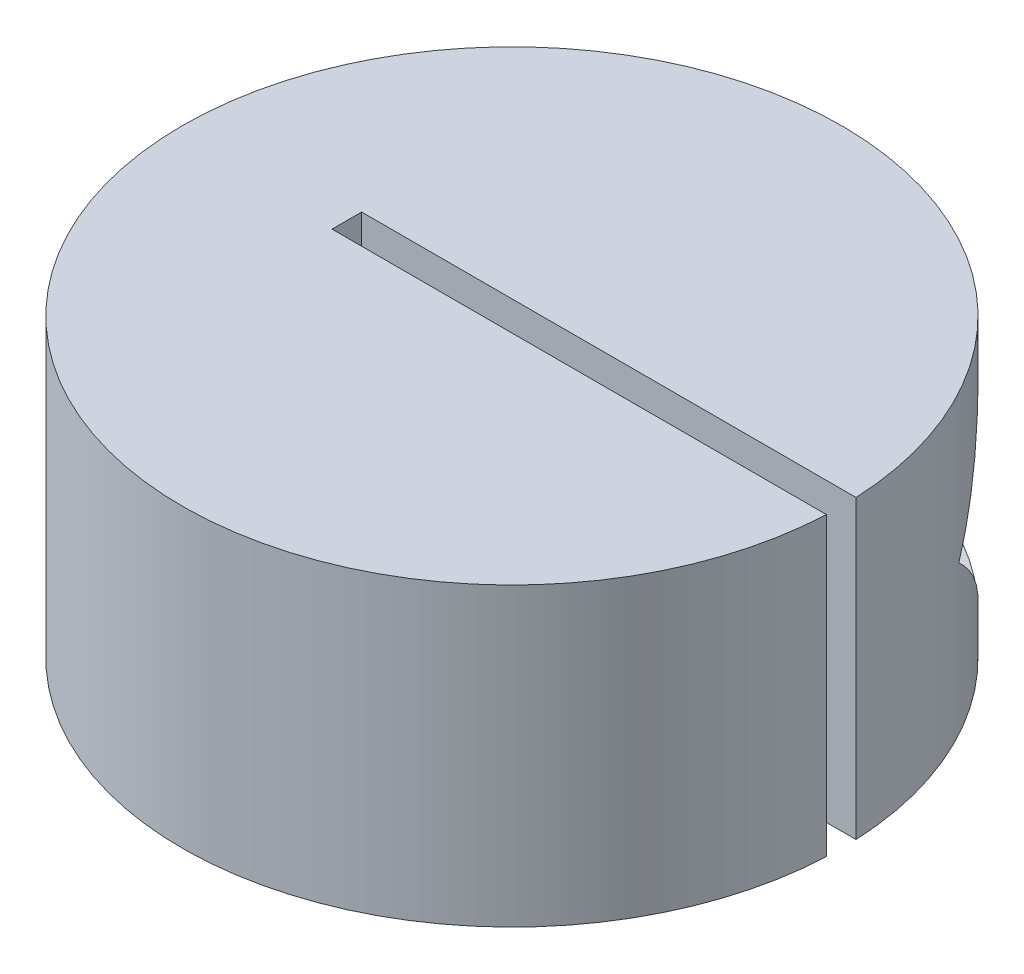
ISO-10303-21;
HEADER;
FILE_DESCRIPTION(('STEP AP214'),'2;1');
FILE_NAME('part.step','',(''),(''),'','','');
FILE_SCHEMA(('AUTOMOTIVE_DESIGN { 1 0 10303 214 1 1 1 1 }'));
ENDSEC;
DATA;
#1=APPLICATION_CONTEXT('core data for automotive mechanical design processes');
#2=APPLICATION_PROTOCOL_DEFINITION('international standard','automotive_design',2000,#1);
#3=PRODUCT_CONTEXT('',#1,'mechanical');
#4=PRODUCT('Part','Part','',(#3));
#5=PRODUCT_RELATED_PRODUCT_CATEGORY('part','',(#4));
#6=PRODUCT_DEFINITION_FORMATION('','',#4);
#7=PRODUCT_DEFINITION_CONTEXT('part definition',#1,'design');
#8=PRODUCT_DEFINITION('design','',#6,#7);
#9=PRODUCT_DEFINITION_SHAPE('','',#8);
#10=(LENGTH_UNIT() NAMED_UNIT(*) SI_UNIT(.MILLI.,.METRE.));
#11=(NAMED_UNIT(*) PLANE_ANGLE_UNIT() SI_UNIT($,.RADIAN.));
#12=(NAMED_UNIT(*) SI_UNIT($,.STERADIAN.) SOLID_ANGLE_UNIT());
#13=UNCERTAINTY_MEASURE_WITH_UNIT(LENGTH_MEASURE(1.E-05),#10,'distance_accuracy_value','');
#14=(GEOMETRIC_REPRESENTATION_CONTEXT(3) GLOBAL_UNCERTAINTY_ASSIGNED_CONTEXT((#13)) GLOBAL_UNIT_ASSIGNED_CONTEXT((#10,
#11,#12)) REPRESENTATION_CONTEXT('',''));
#15=CARTESIAN_POINT('',(0.,0.,0.));
#16=DIRECTION('',(0.,0.,1.));
#17=DIRECTION('',(1.,0.,0.));
#18=AXIS2_PLACEMENT_3D('',#15,#16,#17);
#19=CARTESIAN_POINT('',(0.,10.,0.));
#20=DIRECTION('',(0.,-1.,0.));
#21=DIRECTION('',(0.,0.,-1.));
#22=AXIS2_PLACEMENT_3D('',#19,#20,#21);
#23=CYLINDRICAL_SURFACE('',#22,11.125);
#24=CARTESIAN_POINT('',(0.,2.62851619994366,0.));
#25=DIRECTION('',(-0.867932415787894,0.496682314588098,0.));
#26=DIRECTION('',(-0.496682314588098,-0.867932415787894,0.));
#27=AXIS2_PLACEMENT_3D('',#24,#25,#26);
#28=ELLIPSE('',#27,22.3986231706801,11.125);
#29=CARTESIAN_POINT('',(3.44121947068064,8.64190914895799,-10.5793966536192));
#30=VERTEX_POINT('',#29);
#31=CARTESIAN_POINT('',(1.34787389406774,4.98387174753513,-11.0430458192335));
#32=VERTEX_POINT('',#31);
#33=EDGE_CURVE('E227',#30,#32,#28,.T.);
#34=ORIENTED_EDGE('',*,*,#33,.T.);
#35=CARTESIAN_POINT('',(0.,7.29796184481329,0.));
#36=DIRECTION('',(-0.864105709937694,-0.503310363546265,0.));
#37=DIRECTION('',(0.503310363546265,-0.864105709937694,0.));
#38=AXIS2_PLACEMENT_3D('',#35,#36,#37);
#39=ELLIPSE('',#38,22.1036577145254,11.125);
#40=CARTESIAN_POINT('',(3.4691544233871,1.34196259857714,-10.5702692769245));
#41=VERTEX_POINT('',#40);
#42=EDGE_CURVE('E53',#32,#41,#39,.T.);
#43=ORIENTED_EDGE('',*,*,#42,.T.);
#44=CARTESIAN_POINT('',(0.,1.32868706784826,0.));
#45=DIRECTION('',(0.00382670585019994,-0.999992678134363,0.));
#46=DIRECTION('',(-0.999992678134363,-0.00382670585019994,0.));
#47=AXIS2_PLACEMENT_3D('',#44,#45,#46);
#48=ELLIPSE('',#47,11.1250814563516,11.125);
#49=CARTESIAN_POINT('',(7.68378052931936,1.35809085104201,-8.04519370663334));
#50=VERTEX_POINT('',#49);
#51=EDGE_CURVE('E208',#41,#50,#48,.T.);
#52=ORIENTED_EDGE('',*,*,#51,.T.);
#53=CARTESIAN_POINT('',(0.,-12.0690073187948,0.));
#54=DIRECTION('',(0.867932415787894,-0.496682314588097,0.));
#55=DIRECTION('',(-0.496682314588097,-0.867932415787894,0.));
#56=AXIS2_PLACEMENT_3D('',#53,#54,#55);
#57=ELLIPSE('',#56,22.3986231706801,11.125);
#58=CARTESIAN_POINT('',(9.77712610593226,5.01612825246488,-5.30786492939467));
#59=VERTEX_POINT('',#58);
#60=EDGE_CURVE('E215',#50,#59,#57,.T.);
#61=ORIENTED_EDGE('',*,*,#60,.T.);
#62=CARTESIAN_POINT('',(0.,21.8019349968165,0.));
#63=DIRECTION('',(0.864105709937694,0.503310363546265,0.));
#64=DIRECTION('',(0.503310363546265,-0.864105709937694,0.));
#65=AXIS2_PLACEMENT_3D('',#62,#63,#64);
#66=ELLIPSE('',#65,22.1036577145254,11.125);
#67=CARTESIAN_POINT('',(7.6558455766129,8.65803740142286,-8.07178130941718));
#68=VERTEX_POINT('',#67);
#69=EDGE_CURVE('E219',#59,#68,#66,.T.);
#70=ORIENTED_EDGE('',*,*,#69,.T.);
#71=CARTESIAN_POINT('',(0.,8.62874051785876,0.));
#72=DIRECTION('',(-0.00382670585020004,0.999992678134363,0.));
#73=DIRECTION('',(-0.999992678134363,-0.00382670585020004,0.));
#74=AXIS2_PLACEMENT_3D('',#71,#72,#73);
#75=ELLIPSE('',#74,11.1250814563516,11.125);
#76=EDGE_CURVE('E223',#68,#30,#75,.T.);
#77=ORIENTED_EDGE('',*,*,#76,.T.);
#78=EDGE_LOOP('',(#34,#43,#52,#61,#70,#77));
#79=FACE_BOUND('',#78,.T.);
#80=DIRECTION('',(0.,-1.,0.));
#81=VECTOR('',#80,1.);
#82=CARTESIAN_POINT('',(11.1137583651976,10.,-0.500000000000002));
#83=LINE('',#82,#81);
#84=CARTESIAN_POINT('',(11.1137583651976,0.,-0.500000000000002));
#85=VERTEX_POINT('',#84);
#86=CARTESIAN_POINT('',(11.1137583651976,10.,-0.500000000000002));
#87=VERTEX_POINT('',#86);
#88=EDGE_CURVE('E128',#85,#87,#83,.F.);
#89=ORIENTED_EDGE('',*,*,#88,.F.);
#90=CARTESIAN_POINT('',(0.,0.,0.));
#91=DIRECTION('',(0.,1.,0.));
#92=DIRECTION('',(0.,0.,1.));
#93=AXIS2_PLACEMENT_3D('',#90,#91,#92);
#94=CIRCLE('',#93,11.125);
#95=CARTESIAN_POINT('',(11.1137583651976,0.,0.500000000000002));
#96=VERTEX_POINT('',#95);
#97=EDGE_CURVE('E185',#85,#96,#94,.T.);
#98=ORIENTED_EDGE('',*,*,#97,.T.);
#99=DIRECTION('',(0.,-1.,0.));
#100=VECTOR('',#99,1.);
#101=CARTESIAN_POINT('',(11.1137583651976,10.,0.500000000000002));
#102=LINE('',#101,#100);
#103=CARTESIAN_POINT('',(11.1137583651976,10.,0.500000000000002));
#104=VERTEX_POINT('',#103);
#105=EDGE_CURVE('E60',#104,#96,#102,.T.);
#106=ORIENTED_EDGE('',*,*,#105,.F.);
#107=CARTESIAN_POINT('',(0.,10.,0.));
#108=DIRECTION('',(0.,1.,0.));
#109=DIRECTION('',(0.,0.,1.));
#110=AXIS2_PLACEMENT_3D('',#107,#108,#109);
#111=CIRCLE('',#110,11.125);
#112=EDGE_CURVE('E205',#87,#104,#111,.T.);
#113=ORIENTED_EDGE('',*,*,#112,.F.);
#114=EDGE_LOOP('',(#89,#98,#106,#113));
#115=FACE_BOUND('',#114,.T.);
#116=ADVANCED_FACE('F45',(#79,#115),#23,.T.);
#117=CARTESIAN_POINT('',(0.,10.,0.));
#118=DIRECTION('',(0.,1.,0.));
#119=DIRECTION('',(0.,0.,1.));
#120=AXIS2_PLACEMENT_3D('',#117,#118,#119);
#121=PLANE('',#120);
#122=DIRECTION('',(0.,0.,1.));
#123=VECTOR('',#122,1.);
#124=CARTESIAN_POINT('',(-5.57352546433469,10.,-0.5));
#125=LINE('',#124,#123);
#126=CARTESIAN_POINT('',(-5.57352546433469,10.,-0.5));
#127=VERTEX_POINT('',#126);
#128=CARTESIAN_POINT('',(-5.57352546433469,10.,0.5));
#129=VERTEX_POINT('',#128);
#130=EDGE_CURVE('E134',#127,#129,#125,.T.);
#131=ORIENTED_EDGE('',*,*,#130,.F.);
#132=DIRECTION('',(-1.,0.,0.));
#133=VECTOR('',#132,1.);
#134=CARTESIAN_POINT('',(11.4264745356653,10.,-0.500000000000002));
#135=LINE('',#134,#133);
#136=EDGE_CURVE('E122',#87,#127,#135,.T.);
#137=ORIENTED_EDGE('',*,*,#136,.F.);
#138=ORIENTED_EDGE('',*,*,#112,.T.);
#139=DIRECTION('',(1.,0.,0.));
#140=VECTOR('',#139,1.);
#141=CARTESIAN_POINT('',(-5.57352546433469,10.,0.5));
#142=LINE('',#141,#140);
#143=EDGE_CURVE('E147',#129,#104,#142,.T.);
#144=ORIENTED_EDGE('',*,*,#143,.F.);
#145=EDGE_LOOP('',(#131,#137,#138,#144));
#146=FACE_BOUND('',#145,.T.);
#147=ADVANCED_FACE('F146',(#146),#121,.T.);
#148=CARTESIAN_POINT('',(0.,0.,0.));
#149=DIRECTION('',(0.,1.,0.));
#150=DIRECTION('',(0.,0.,1.));
#151=AXIS2_PLACEMENT_3D('',#148,#149,#150);
#152=PLANE('',#151);
#153=DIRECTION('',(-1.,0.,0.));
#154=VECTOR('',#153,1.);
#155=CARTESIAN_POINT('',(11.4264745356653,0.,-0.500000000000002));
#156=LINE('',#155,#154);
#157=CARTESIAN_POINT('',(-5.57352546433469,0.,-0.5));
#158=VERTEX_POINT('',#157);
#159=EDGE_CURVE('E153',#85,#158,#156,.T.);
#160=ORIENTED_EDGE('',*,*,#159,.T.);
#161=DIRECTION('',(0.,0.,1.));
#162=VECTOR('',#161,1.);
#163=CARTESIAN_POINT('',(-5.57352546433469,0.,-0.5));
#164=LINE('',#163,#162);
#165=CARTESIAN_POINT('',(-5.57352546433469,0.,0.5));
#166=VERTEX_POINT('',#165);
#167=EDGE_CURVE('E141',#158,#166,#164,.T.);
#168=ORIENTED_EDGE('',*,*,#167,.T.);
#169=DIRECTION('',(1.,0.,0.));
#170=VECTOR('',#169,1.);
#171=CARTESIAN_POINT('',(-5.57352546433469,0.,0.5));
#172=LINE('',#171,#170);
#173=EDGE_CURVE('E135',#166,#96,#172,.T.);
#174=ORIENTED_EDGE('',*,*,#173,.T.);
#175=ORIENTED_EDGE('',*,*,#97,.F.);
#176=EDGE_LOOP('',(#160,#168,#174,#175));
#177=FACE_BOUND('',#176,.T.);
#178=ADVANCED_FACE('F270',(#177),#152,.F.);
#179=CARTESIAN_POINT('',(1.34787389406774,4.98387174753513,-11.125));
#180=DIRECTION('',(-0.864105709937694,-0.503310363546265,0.));
#181=DIRECTION('',(0.503310363546265,-0.864105709937694,0.));
#182=AXIS2_PLACEMENT_3D('',#179,#180,#181);
#183=PLANE('',#182);
#184=DIRECTION('',(-0.503310363546265,0.864105709937694,0.));
#185=VECTOR('',#184,1.);
#186=CARTESIAN_POINT('',(1.34787389406774,4.98387174753513,-0.5));
#187=LINE('',#186,#185);
#188=CARTESIAN_POINT('',(3.4691544233871,1.34196259857714,-0.5));
#189=VERTEX_POINT('',#188);
#190=CARTESIAN_POINT('',(1.34787389406774,4.98387174753513,-0.5));
#191=VERTEX_POINT('',#190);
#192=EDGE_CURVE('E173',#189,#191,#187,.T.);
#193=ORIENTED_EDGE('',*,*,#192,.F.);
#194=DIRECTION('',(0.,0.,1.));
#195=VECTOR('',#194,1.);
#196=CARTESIAN_POINT('',(3.4691544233871,1.34196259857714,-11.125));
#197=LINE('',#196,#195);
#198=EDGE_CURVE('E180',#41,#189,#197,.T.);
#199=ORIENTED_EDGE('',*,*,#198,.F.);
#200=ORIENTED_EDGE('',*,*,#42,.F.);
#201=DIRECTION('',(0.,0.,1.));
#202=VECTOR('',#201,1.);
#203=CARTESIAN_POINT('',(1.34787389406774,4.98387174753513,-11.125));
#204=LINE('',#203,#202);
#205=EDGE_CURVE('E181',#32,#191,#204,.T.);
#206=ORIENTED_EDGE('',*,*,#205,.T.);
#207=EDGE_LOOP('',(#193,#199,#200,#206));
#208=FACE_BOUND('',#207,.T.);
#209=ADVANCED_FACE('F238',(#208),#183,.F.);
#210=CARTESIAN_POINT('',(3.44121947068064,8.64190914895799,-11.125));
#211=DIRECTION('',(-0.867932415787894,0.496682314588098,0.));
#212=DIRECTION('',(-0.496682314588098,-0.867932415787894,0.));
#213=AXIS2_PLACEMENT_3D('',#210,#211,#212);
#214=PLANE('',#213);
#215=DIRECTION('',(0.496682314588098,0.867932415787894,0.));
#216=VECTOR('',#215,1.);
#217=CARTESIAN_POINT('',(3.44121947068064,8.64190914895799,-0.5));
#218=LINE('',#217,#216);
#219=CARTESIAN_POINT('',(3.44121947068064,8.64190914895799,-0.500000000000002));
#220=VERTEX_POINT('',#219);
#221=EDGE_CURVE('E170',#191,#220,#218,.T.);
#222=ORIENTED_EDGE('',*,*,#221,.F.);
#223=ORIENTED_EDGE('',*,*,#205,.F.);
#224=ORIENTED_EDGE('',*,*,#33,.F.);
#225=DIRECTION('',(0.,0.,1.));
#226=VECTOR('',#225,1.);
#227=CARTESIAN_POINT('',(3.44121947068064,8.64190914895799,-11.125));
#228=LINE('',#227,#226);
#229=EDGE_CURVE('E186',#30,#220,#228,.T.);
#230=ORIENTED_EDGE('',*,*,#229,.T.);
#231=EDGE_LOOP('',(#222,#223,#224,#230));
#232=FACE_BOUND('',#231,.T.);
#233=ADVANCED_FACE('F241',(#232),#214,.F.);
#234=CARTESIAN_POINT('',(7.6558455766129,8.65803740142286,-11.125));
#235=DIRECTION('',(-0.00382670585020004,0.999992678134363,0.));
#236=DIRECTION('',(-0.999992678134363,-0.00382670585020004,0.));
#237=AXIS2_PLACEMENT_3D('',#234,#235,#236);
#238=PLANE('',#237);
#239=DIRECTION('',(0.999992678134363,0.00382670585020004,0.));
#240=VECTOR('',#239,1.);
#241=CARTESIAN_POINT('',(7.6558455766129,8.65803740142286,-0.500000000000002));
#242=LINE('',#241,#240);
#243=CARTESIAN_POINT('',(7.6558455766129,8.65803740142286,-0.500000000000002));
#244=VERTEX_POINT('',#243);
#245=EDGE_CURVE('E167',#220,#244,#242,.T.);
#246=ORIENTED_EDGE('',*,*,#245,.F.);
#247=ORIENTED_EDGE('',*,*,#229,.F.);
#248=ORIENTED_EDGE('',*,*,#76,.F.);
#249=DIRECTION('',(0.,0.,1.));
#250=VECTOR('',#249,1.);
#251=CARTESIAN_POINT('',(7.6558455766129,8.65803740142286,-11.125));
#252=LINE('',#251,#250);
#253=EDGE_CURVE('E190',#68,#244,#252,.T.);
#254=ORIENTED_EDGE('',*,*,#253,.T.);
#255=EDGE_LOOP('',(#246,#247,#248,#254));
#256=FACE_BOUND('',#255,.T.);
#257=ADVANCED_FACE('F246',(#256),#238,.F.);
#258=CARTESIAN_POINT('',(9.77712610593226,5.01612825246488,-11.125));
#259=DIRECTION('',(0.864105709937694,0.503310363546265,0.));
#260=DIRECTION('',(-0.503310363546265,0.864105709937694,0.));
#261=AXIS2_PLACEMENT_3D('',#258,#259,#260);
#262=PLANE('',#261);
#263=DIRECTION('',(0.503310363546265,-0.864105709937694,0.));
#264=VECTOR('',#263,1.);
#265=CARTESIAN_POINT('',(9.77712610593226,5.01612825246488,-0.500000000000002));
#266=LINE('',#265,#264);
#267=CARTESIAN_POINT('',(9.77712610593226,5.01612825246488,-0.500000000000002));
#268=VERTEX_POINT('',#267);
#269=EDGE_CURVE('E164',#244,#268,#266,.T.);
#270=ORIENTED_EDGE('',*,*,#269,.F.);
#271=ORIENTED_EDGE('',*,*,#253,.F.);
#272=ORIENTED_EDGE('',*,*,#69,.F.);
#273=DIRECTION('',(0.,0.,1.));
#274=VECTOR('',#273,1.);
#275=CARTESIAN_POINT('',(9.77712610593226,5.01612825246488,-11.125));
#276=LINE('',#275,#274);
#277=EDGE_CURVE('E194',#59,#268,#276,.T.);
#278=ORIENTED_EDGE('',*,*,#277,.T.);
#279=EDGE_LOOP('',(#270,#271,#272,#278));
#280=FACE_BOUND('',#279,.T.);
#281=ADVANCED_FACE('F249',(#280),#262,.F.);
#282=CARTESIAN_POINT('',(7.68378052931936,1.35809085104201,-11.125));
#283=DIRECTION('',(0.867932415787894,-0.496682314588097,0.));
#284=DIRECTION('',(0.496682314588097,0.867932415787895,0.));
#285=AXIS2_PLACEMENT_3D('',#282,#283,#284);
#286=PLANE('',#285);
#287=DIRECTION('',(-0.496682314588097,-0.867932415787895,0.));
#288=VECTOR('',#287,1.);
#289=CARTESIAN_POINT('',(7.68378052931936,1.35809085104201,-0.500000000000002));
#290=LINE('',#289,#288);
#291=CARTESIAN_POINT('',(7.68378052931936,1.35809085104201,-0.5));
#292=VERTEX_POINT('',#291);
#293=EDGE_CURVE('E67',#268,#292,#290,.T.);
#294=ORIENTED_EDGE('',*,*,#293,.F.);
#295=ORIENTED_EDGE('',*,*,#277,.F.);
#296=ORIENTED_EDGE('',*,*,#60,.F.);
#297=DIRECTION('',(0.,0.,1.));
#298=VECTOR('',#297,1.);
#299=CARTESIAN_POINT('',(7.68378052931936,1.35809085104201,-11.125));
#300=LINE('',#299,#298);
#301=EDGE_CURVE('E198',#50,#292,#300,.T.);
#302=ORIENTED_EDGE('',*,*,#301,.T.);
#303=EDGE_LOOP('',(#294,#295,#296,#302));
#304=FACE_BOUND('',#303,.T.);
#305=ADVANCED_FACE('F253',(#304),#286,.F.);
#306=CARTESIAN_POINT('',(3.4691544233871,1.34196259857714,-11.125));
#307=DIRECTION('',(0.00382670585019994,-0.999992678134363,0.));
#308=DIRECTION('',(0.999992678134363,0.00382670585019994,0.));
#309=AXIS2_PLACEMENT_3D('',#306,#307,#308);
#310=PLANE('',#309);
#311=DIRECTION('',(-0.999992678134363,-0.00382670585019994,0.));
#312=VECTOR('',#311,1.);
#313=CARTESIAN_POINT('',(3.4691544233871,1.34196259857714,-0.5));
#314=LINE('',#313,#312);
#315=EDGE_CURVE('E11',#292,#189,#314,.T.);
#316=ORIENTED_EDGE('',*,*,#315,.F.);
#317=ORIENTED_EDGE('',*,*,#301,.F.);
#318=ORIENTED_EDGE('',*,*,#51,.F.);
#319=ORIENTED_EDGE('',*,*,#198,.T.);
#320=EDGE_LOOP('',(#316,#317,#318,#319));
#321=FACE_BOUND('',#320,.T.);
#322=ADVANCED_FACE('F255',(#321),#310,.F.);
#323=CARTESIAN_POINT('',(-5.57352546433469,10.,0.5));
#324=DIRECTION('',(0.,0.,-1.));
#325=DIRECTION('',(-1.,0.,0.));
#326=AXIS2_PLACEMENT_3D('',#323,#324,#325);
#327=PLANE('',#326);
#328=ORIENTED_EDGE('',*,*,#105,.T.);
#329=ORIENTED_EDGE('',*,*,#173,.F.);
#330=DIRECTION('',(0.,-1.,0.));
#331=VECTOR('',#330,1.);
#332=CARTESIAN_POINT('',(-5.57352546433469,10.,0.5));
#333=LINE('',#332,#331);
#334=EDGE_CURVE('E143',#129,#166,#333,.T.);
#335=ORIENTED_EDGE('',*,*,#334,.F.);
#336=ORIENTED_EDGE('',*,*,#143,.T.);
#337=EDGE_LOOP('',(#328,#329,#335,#336));
#338=FACE_BOUND('',#337,.T.);
#339=ADVANCED_FACE('F257',(#338),#327,.T.);
#340=CARTESIAN_POINT('',(11.4264745356653,10.,-0.500000000000002));
#341=DIRECTION('',(0.,0.,1.));
#342=DIRECTION('',(1.,0.,0.));
#343=AXIS2_PLACEMENT_3D('',#340,#341,#342);
#344=PLANE('',#343);
#345=ORIENTED_EDGE('',*,*,#192,.T.);
#346=ORIENTED_EDGE('',*,*,#221,.T.);
#347=ORIENTED_EDGE('',*,*,#245,.T.);
#348=ORIENTED_EDGE('',*,*,#269,.T.);
#349=ORIENTED_EDGE('',*,*,#293,.T.);
#350=ORIENTED_EDGE('',*,*,#315,.T.);
#351=EDGE_LOOP('',(#345,#346,#347,#348,#349,#350));
#352=FACE_BOUND('',#351,.T.);
#353=ORIENTED_EDGE('',*,*,#88,.T.);
#354=ORIENTED_EDGE('',*,*,#136,.T.);
#355=DIRECTION('',(0.,-1.,0.));
#356=VECTOR('',#355,1.);
#357=CARTESIAN_POINT('',(-5.57352546433469,10.,-0.5));
#358=LINE('',#357,#356);
#359=EDGE_CURVE('E125',#127,#158,#358,.T.);
#360=ORIENTED_EDGE('',*,*,#359,.T.);
#361=ORIENTED_EDGE('',*,*,#159,.F.);
#362=EDGE_LOOP('',(#353,#354,#360,#361));
#363=FACE_BOUND('',#362,.T.);
#364=ADVANCED_FACE('F124',(#352,#363),#344,.T.);
#365=CARTESIAN_POINT('',(-5.57352546433469,10.,-0.5));
#366=DIRECTION('',(1.,0.,0.));
#367=DIRECTION('',(0.,0.,-1.));
#368=AXIS2_PLACEMENT_3D('',#365,#366,#367);
#369=PLANE('',#368);
#370=ORIENTED_EDGE('',*,*,#167,.F.);
#371=ORIENTED_EDGE('',*,*,#359,.F.);
#372=ORIENTED_EDGE('',*,*,#130,.T.);
#373=ORIENTED_EDGE('',*,*,#334,.T.);
#374=EDGE_LOOP('',(#370,#371,#372,#373));
#375=FACE_BOUND('',#374,.T.);
#376=ADVANCED_FACE('F138',(#375),#369,.T.);
#377=CLOSED_SHELL('',(#116,#147,#178,#209,#233,#257,#281,#305,#322,#339,#364,#376));
#378=MANIFOLD_SOLID_BREP('B2',#377);
#379=ADVANCED_BREP_SHAPE_REPRESENTATION('',(#18,#378),#14);
#380=SHAPE_DEFINITION_REPRESENTATION(#9,#379);
ENDSEC;
END-ISO-10303-21;
